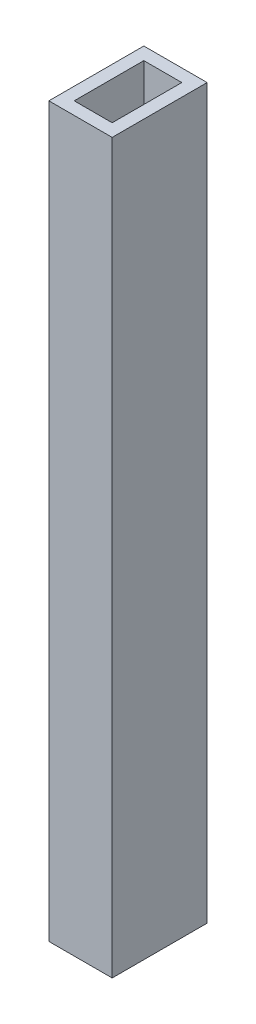
ISO-10303-21;
HEADER;
FILE_DESCRIPTION(('STEP AP214'),'2;1');
FILE_NAME('part.step','',(''),(''),'','','');
FILE_SCHEMA(('AUTOMOTIVE_DESIGN { 1 0 10303 214 1 1 1 1 }'));
ENDSEC;
DATA;
#1=APPLICATION_CONTEXT('core data for automotive mechanical design processes');
#2=APPLICATION_PROTOCOL_DEFINITION('international standard','automotive_design',2000,#1);
#3=PRODUCT_CONTEXT('',#1,'mechanical');
#4=PRODUCT('Part','Part','',(#3));
#5=PRODUCT_RELATED_PRODUCT_CATEGORY('part','',(#4));
#6=PRODUCT_DEFINITION_FORMATION('','',#4);
#7=PRODUCT_DEFINITION_CONTEXT('part definition',#1,'design');
#8=PRODUCT_DEFINITION('design','',#6,#7);
#9=PRODUCT_DEFINITION_SHAPE('','',#8);
#10=(LENGTH_UNIT() NAMED_UNIT(*) SI_UNIT(.MILLI.,.METRE.));
#11=(NAMED_UNIT(*) PLANE_ANGLE_UNIT() SI_UNIT($,.RADIAN.));
#12=(NAMED_UNIT(*) SI_UNIT($,.STERADIAN.) SOLID_ANGLE_UNIT());
#13=UNCERTAINTY_MEASURE_WITH_UNIT(LENGTH_MEASURE(1.E-05),#10,'distance_accuracy_value','');
#14=(GEOMETRIC_REPRESENTATION_CONTEXT(3) GLOBAL_UNCERTAINTY_ASSIGNED_CONTEXT((#13)) GLOBAL_UNIT_ASSIGNED_CONTEXT((#10,
#11,#12)) REPRESENTATION_CONTEXT('',''));
#15=CARTESIAN_POINT('',(0.,0.,0.));
#16=DIRECTION('',(0.,0.,1.));
#17=DIRECTION('',(1.,0.,0.));
#18=AXIS2_PLACEMENT_3D('',#15,#16,#17);
#19=CARTESIAN_POINT('',(5.,115.,-7.5));
#20=DIRECTION('',(-1.,0.,0.));
#21=DIRECTION('',(0.,0.,1.));
#22=AXIS2_PLACEMENT_3D('',#19,#20,#21);
#23=PLANE('',#22);
#24=DIRECTION('',(0.,0.,-1.));
#25=VECTOR('',#24,1.);
#26=CARTESIAN_POINT('',(5.,0.,-7.5));
#27=LINE('',#26,#25);
#28=CARTESIAN_POINT('',(5.,0.,7.5));
#29=VERTEX_POINT('',#28);
#30=CARTESIAN_POINT('',(5.,0.,-7.5));
#31=VERTEX_POINT('',#30);
#32=EDGE_CURVE('E188',#29,#31,#27,.T.);
#33=ORIENTED_EDGE('',*,*,#32,.T.);
#34=DIRECTION('',(0.,-1.,0.));
#35=VECTOR('',#34,1.);
#36=CARTESIAN_POINT('',(5.,115.,-7.5));
#37=LINE('',#36,#35);
#38=CARTESIAN_POINT('',(5.,115.,-7.5));
#39=VERTEX_POINT('',#38);
#40=EDGE_CURVE('E11',#39,#31,#37,.T.);
#41=ORIENTED_EDGE('',*,*,#40,.F.);
#42=DIRECTION('',(0.,0.,-1.));
#43=VECTOR('',#42,1.);
#44=CARTESIAN_POINT('',(5.,115.,-7.5));
#45=LINE('',#44,#43);
#46=CARTESIAN_POINT('',(5.,115.,7.5));
#47=VERTEX_POINT('',#46);
#48=EDGE_CURVE('E194',#47,#39,#45,.T.);
#49=ORIENTED_EDGE('',*,*,#48,.F.);
#50=DIRECTION('',(0.,-1.,0.));
#51=VECTOR('',#50,1.);
#52=CARTESIAN_POINT('',(5.,115.,7.5));
#53=LINE('',#52,#51);
#54=EDGE_CURVE('E204',#47,#29,#53,.T.);
#55=ORIENTED_EDGE('',*,*,#54,.T.);
#56=EDGE_LOOP('',(#33,#41,#49,#55));
#57=FACE_BOUND('',#56,.T.);
#58=ADVANCED_FACE('F39',(#57),#23,.F.);
#59=CARTESIAN_POINT('',(-5.,115.,-7.5));
#60=DIRECTION('',(0.,0.,1.));
#61=DIRECTION('',(1.,0.,0.));
#62=AXIS2_PLACEMENT_3D('',#59,#60,#61);
#63=PLANE('',#62);
#64=DIRECTION('',(-1.,0.,0.));
#65=VECTOR('',#64,1.);
#66=CARTESIAN_POINT('',(-5.,0.,-7.5));
#67=LINE('',#66,#65);
#68=CARTESIAN_POINT('',(-5.,0.,-7.5));
#69=VERTEX_POINT('',#68);
#70=EDGE_CURVE('E207',#31,#69,#67,.T.);
#71=ORIENTED_EDGE('',*,*,#70,.T.);
#72=DIRECTION('',(0.,-1.,0.));
#73=VECTOR('',#72,1.);
#74=CARTESIAN_POINT('',(-5.,115.,-7.5));
#75=LINE('',#74,#73);
#76=CARTESIAN_POINT('',(-5.,115.,-7.5));
#77=VERTEX_POINT('',#76);
#78=EDGE_CURVE('E46',#77,#69,#75,.T.);
#79=ORIENTED_EDGE('',*,*,#78,.F.);
#80=DIRECTION('',(-1.,0.,0.));
#81=VECTOR('',#80,1.);
#82=CARTESIAN_POINT('',(-5.,115.,-7.5));
#83=LINE('',#82,#81);
#84=EDGE_CURVE('E197',#39,#77,#83,.T.);
#85=ORIENTED_EDGE('',*,*,#84,.F.);
#86=ORIENTED_EDGE('',*,*,#40,.T.);
#87=EDGE_LOOP('',(#71,#79,#85,#86));
#88=FACE_BOUND('',#87,.T.);
#89=ADVANCED_FACE('F237',(#88),#63,.F.);
#90=CARTESIAN_POINT('',(-5.,115.,-7.5));
#91=DIRECTION('',(1.,0.,0.));
#92=DIRECTION('',(0.,0.,-1.));
#93=AXIS2_PLACEMENT_3D('',#90,#91,#92);
#94=PLANE('',#93);
#95=DIRECTION('',(0.,0.,1.));
#96=VECTOR('',#95,1.);
#97=CARTESIAN_POINT('',(-5.,0.,-7.5));
#98=LINE('',#97,#96);
#99=CARTESIAN_POINT('',(-5.,0.,7.5));
#100=VERTEX_POINT('',#99);
#101=EDGE_CURVE('E209',#69,#100,#98,.T.);
#102=ORIENTED_EDGE('',*,*,#101,.T.);
#103=DIRECTION('',(0.,-1.,0.));
#104=VECTOR('',#103,1.);
#105=CARTESIAN_POINT('',(-5.,115.,7.5));
#106=LINE('',#105,#104);
#107=CARTESIAN_POINT('',(-5.,115.,7.5));
#108=VERTEX_POINT('',#107);
#109=EDGE_CURVE('E214',#108,#100,#106,.T.);
#110=ORIENTED_EDGE('',*,*,#109,.F.);
#111=DIRECTION('',(0.,0.,1.));
#112=VECTOR('',#111,1.);
#113=CARTESIAN_POINT('',(-5.,115.,-7.5));
#114=LINE('',#113,#112);
#115=EDGE_CURVE('E200',#77,#108,#114,.T.);
#116=ORIENTED_EDGE('',*,*,#115,.F.);
#117=ORIENTED_EDGE('',*,*,#78,.T.);
#118=EDGE_LOOP('',(#102,#110,#116,#117));
#119=FACE_BOUND('',#118,.T.);
#120=ADVANCED_FACE('F221',(#119),#94,.F.);
#121=CARTESIAN_POINT('',(-5.,115.,7.5));
#122=DIRECTION('',(0.,0.,-1.));
#123=DIRECTION('',(-1.,0.,0.));
#124=AXIS2_PLACEMENT_3D('',#121,#122,#123);
#125=PLANE('',#124);
#126=DIRECTION('',(1.,0.,0.));
#127=VECTOR('',#126,1.);
#128=CARTESIAN_POINT('',(-5.,0.,7.5));
#129=LINE('',#128,#127);
#130=EDGE_CURVE('E198',#100,#29,#129,.T.);
#131=ORIENTED_EDGE('',*,*,#130,.T.);
#132=ORIENTED_EDGE('',*,*,#54,.F.);
#133=DIRECTION('',(1.,0.,0.));
#134=VECTOR('',#133,1.);
#135=CARTESIAN_POINT('',(-5.,115.,7.5));
#136=LINE('',#135,#134);
#137=EDGE_CURVE('E202',#108,#47,#136,.T.);
#138=ORIENTED_EDGE('',*,*,#137,.F.);
#139=ORIENTED_EDGE('',*,*,#109,.T.);
#140=EDGE_LOOP('',(#131,#132,#138,#139));
#141=FACE_BOUND('',#140,.T.);
#142=ADVANCED_FACE('F230',(#141),#125,.F.);
#143=CARTESIAN_POINT('',(0.,115.,0.));
#144=DIRECTION('',(0.,1.,0.));
#145=DIRECTION('',(0.,0.,1.));
#146=AXIS2_PLACEMENT_3D('',#143,#144,#145);
#147=PLANE('',#146);
#148=DIRECTION('',(0.,0.,-1.));
#149=VECTOR('',#148,1.);
#150=CARTESIAN_POINT('',(3.,115.,-7.5));
#151=LINE('',#150,#149);
#152=CARTESIAN_POINT('',(3.,115.,5.5));
#153=VERTEX_POINT('',#152);
#154=CARTESIAN_POINT('',(3.,115.,-5.5));
#155=VERTEX_POINT('',#154);
#156=EDGE_CURVE('E156',#153,#155,#151,.T.);
#157=ORIENTED_EDGE('',*,*,#156,.F.);
#158=DIRECTION('',(1.,0.,0.));
#159=VECTOR('',#158,1.);
#160=CARTESIAN_POINT('',(-5.,115.,5.5));
#161=LINE('',#160,#159);
#162=CARTESIAN_POINT('',(-3.,115.,5.5));
#163=VERTEX_POINT('',#162);
#164=EDGE_CURVE('E161',#163,#153,#161,.T.);
#165=ORIENTED_EDGE('',*,*,#164,.F.);
#166=DIRECTION('',(0.,0.,1.));
#167=VECTOR('',#166,1.);
#168=CARTESIAN_POINT('',(-3.,115.,-7.5));
#169=LINE('',#168,#167);
#170=CARTESIAN_POINT('',(-3.,115.,-5.5));
#171=VERTEX_POINT('',#170);
#172=EDGE_CURVE('E159',#171,#163,#169,.T.);
#173=ORIENTED_EDGE('',*,*,#172,.F.);
#174=DIRECTION('',(-1.,0.,0.));
#175=VECTOR('',#174,1.);
#176=CARTESIAN_POINT('',(-5.,115.,-5.5));
#177=LINE('',#176,#175);
#178=EDGE_CURVE('E147',#155,#171,#177,.T.);
#179=ORIENTED_EDGE('',*,*,#178,.F.);
#180=EDGE_LOOP('',(#157,#165,#173,#179));
#181=FACE_BOUND('',#180,.T.);
#182=ORIENTED_EDGE('',*,*,#48,.T.);
#183=ORIENTED_EDGE('',*,*,#84,.T.);
#184=ORIENTED_EDGE('',*,*,#115,.T.);
#185=ORIENTED_EDGE('',*,*,#137,.T.);
#186=EDGE_LOOP('',(#182,#183,#184,#185));
#187=FACE_BOUND('',#186,.T.);
#188=ADVANCED_FACE('F236',(#181,#187),#147,.T.);
#189=CARTESIAN_POINT('',(0.,0.,0.));
#190=DIRECTION('',(0.,1.,0.));
#191=DIRECTION('',(0.,0.,1.));
#192=AXIS2_PLACEMENT_3D('',#189,#190,#191);
#193=PLANE('',#192);
#194=DIRECTION('',(-1.,0.,0.));
#195=VECTOR('',#194,1.);
#196=CARTESIAN_POINT('',(-1.5,0.,2.));
#197=LINE('',#196,#195);
#198=CARTESIAN_POINT('',(1.5,0.,2.));
#199=VERTEX_POINT('',#198);
#200=CARTESIAN_POINT('',(-1.5,0.,2.));
#201=VERTEX_POINT('',#200);
#202=EDGE_CURVE('E178',#199,#201,#197,.T.);
#203=ORIENTED_EDGE('',*,*,#202,.F.);
#204=DIRECTION('',(0.,0.,1.));
#205=VECTOR('',#204,1.);
#206=CARTESIAN_POINT('',(1.5,0.,2.));
#207=LINE('',#206,#205);
#208=CARTESIAN_POINT('',(1.5,0.,-2.));
#209=VERTEX_POINT('',#208);
#210=EDGE_CURVE('E61',#209,#199,#207,.T.);
#211=ORIENTED_EDGE('',*,*,#210,.F.);
#212=DIRECTION('',(1.,0.,0.));
#213=VECTOR('',#212,1.);
#214=CARTESIAN_POINT('',(-1.5,0.,-2.));
#215=LINE('',#214,#213);
#216=CARTESIAN_POINT('',(-1.5,0.,-2.));
#217=VERTEX_POINT('',#216);
#218=EDGE_CURVE('E167',#217,#209,#215,.T.);
#219=ORIENTED_EDGE('',*,*,#218,.F.);
#220=DIRECTION('',(0.,0.,-1.));
#221=VECTOR('',#220,1.);
#222=CARTESIAN_POINT('',(-1.5,0.,2.));
#223=LINE('',#222,#221);
#224=EDGE_CURVE('E181',#201,#217,#223,.T.);
#225=ORIENTED_EDGE('',*,*,#224,.F.);
#226=EDGE_LOOP('',(#203,#211,#219,#225));
#227=FACE_BOUND('',#226,.T.);
#228=ORIENTED_EDGE('',*,*,#32,.F.);
#229=ORIENTED_EDGE('',*,*,#130,.F.);
#230=ORIENTED_EDGE('',*,*,#101,.F.);
#231=ORIENTED_EDGE('',*,*,#70,.F.);
#232=EDGE_LOOP('',(#228,#229,#230,#231));
#233=FACE_BOUND('',#232,.T.);
#234=ADVANCED_FACE('F227',(#227,#233),#193,.F.);
#235=CARTESIAN_POINT('',(1.5,3.,2.));
#236=DIRECTION('',(1.,0.,0.));
#237=DIRECTION('',(0.,0.,-1.));
#238=AXIS2_PLACEMENT_3D('',#235,#236,#237);
#239=PLANE('',#238);
#240=ORIENTED_EDGE('',*,*,#210,.T.);
#241=DIRECTION('',(0.,-1.,0.));
#242=VECTOR('',#241,1.);
#243=CARTESIAN_POINT('',(1.5,3.,2.));
#244=LINE('',#243,#242);
#245=CARTESIAN_POINT('',(1.5,3.,2.));
#246=VERTEX_POINT('',#245);
#247=EDGE_CURVE('E176',#246,#199,#244,.T.);
#248=ORIENTED_EDGE('',*,*,#247,.F.);
#249=DIRECTION('',(0.,0.,1.));
#250=VECTOR('',#249,1.);
#251=CARTESIAN_POINT('',(1.5,3.,2.));
#252=LINE('',#251,#250);
#253=CARTESIAN_POINT('',(1.5,3.,-2.));
#254=VERTEX_POINT('',#253);
#255=EDGE_CURVE('E163',#254,#246,#252,.T.);
#256=ORIENTED_EDGE('',*,*,#255,.F.);
#257=DIRECTION('',(0.,-1.,0.));
#258=VECTOR('',#257,1.);
#259=CARTESIAN_POINT('',(1.5,3.,-2.));
#260=LINE('',#259,#258);
#261=EDGE_CURVE('E186',#254,#209,#260,.T.);
#262=ORIENTED_EDGE('',*,*,#261,.T.);
#263=EDGE_LOOP('',(#240,#248,#256,#262));
#264=FACE_BOUND('',#263,.T.);
#265=ADVANCED_FACE('F249',(#264),#239,.F.);
#266=CARTESIAN_POINT('',(-1.5,3.,-2.));
#267=DIRECTION('',(0.,0.,-1.));
#268=DIRECTION('',(-1.,0.,0.));
#269=AXIS2_PLACEMENT_3D('',#266,#267,#268);
#270=PLANE('',#269);
#271=ORIENTED_EDGE('',*,*,#218,.T.);
#272=ORIENTED_EDGE('',*,*,#261,.F.);
#273=DIRECTION('',(1.,0.,0.));
#274=VECTOR('',#273,1.);
#275=CARTESIAN_POINT('',(-1.5,3.,-2.));
#276=LINE('',#275,#274);
#277=CARTESIAN_POINT('',(-1.5,3.,-2.));
#278=VERTEX_POINT('',#277);
#279=EDGE_CURVE('E173',#278,#254,#276,.T.);
#280=ORIENTED_EDGE('',*,*,#279,.F.);
#281=DIRECTION('',(0.,-1.,0.));
#282=VECTOR('',#281,1.);
#283=CARTESIAN_POINT('',(-1.5,3.,-2.));
#284=LINE('',#283,#282);
#285=EDGE_CURVE('E189',#278,#217,#284,.T.);
#286=ORIENTED_EDGE('',*,*,#285,.T.);
#287=EDGE_LOOP('',(#271,#272,#280,#286));
#288=FACE_BOUND('',#287,.T.);
#289=ADVANCED_FACE('F256',(#288),#270,.F.);
#290=CARTESIAN_POINT('',(-1.5,3.,2.));
#291=DIRECTION('',(-1.,0.,0.));
#292=DIRECTION('',(0.,0.,1.));
#293=AXIS2_PLACEMENT_3D('',#290,#291,#292);
#294=PLANE('',#293);
#295=ORIENTED_EDGE('',*,*,#224,.T.);
#296=ORIENTED_EDGE('',*,*,#285,.F.);
#297=DIRECTION('',(0.,0.,-1.));
#298=VECTOR('',#297,1.);
#299=CARTESIAN_POINT('',(-1.5,3.,2.));
#300=LINE('',#299,#298);
#301=CARTESIAN_POINT('',(-1.5,3.,2.));
#302=VERTEX_POINT('',#301);
#303=EDGE_CURVE('E170',#302,#278,#300,.T.);
#304=ORIENTED_EDGE('',*,*,#303,.F.);
#305=DIRECTION('',(0.,-1.,0.));
#306=VECTOR('',#305,1.);
#307=CARTESIAN_POINT('',(-1.5,3.,2.));
#308=LINE('',#307,#306);
#309=EDGE_CURVE('E191',#302,#201,#308,.T.);
#310=ORIENTED_EDGE('',*,*,#309,.T.);
#311=EDGE_LOOP('',(#295,#296,#304,#310));
#312=FACE_BOUND('',#311,.T.);
#313=ADVANCED_FACE('F261',(#312),#294,.F.);
#314=CARTESIAN_POINT('',(-1.5,3.,2.));
#315=DIRECTION('',(0.,0.,1.));
#316=DIRECTION('',(1.,0.,0.));
#317=AXIS2_PLACEMENT_3D('',#314,#315,#316);
#318=PLANE('',#317);
#319=ORIENTED_EDGE('',*,*,#202,.T.);
#320=ORIENTED_EDGE('',*,*,#309,.F.);
#321=DIRECTION('',(-1.,0.,0.));
#322=VECTOR('',#321,1.);
#323=CARTESIAN_POINT('',(-1.5,3.,2.));
#324=LINE('',#323,#322);
#325=EDGE_CURVE('E166',#246,#302,#324,.T.);
#326=ORIENTED_EDGE('',*,*,#325,.F.);
#327=ORIENTED_EDGE('',*,*,#247,.T.);
#328=EDGE_LOOP('',(#319,#320,#326,#327));
#329=FACE_BOUND('',#328,.T.);
#330=ADVANCED_FACE('F257',(#329),#318,.F.);
#331=CARTESIAN_POINT('',(0.,3.,0.));
#332=DIRECTION('',(0.,-1.,0.));
#333=DIRECTION('',(0.,0.,-1.));
#334=AXIS2_PLACEMENT_3D('',#331,#332,#333);
#335=PLANE('',#334);
#336=ORIENTED_EDGE('',*,*,#255,.T.);
#337=ORIENTED_EDGE('',*,*,#325,.T.);
#338=ORIENTED_EDGE('',*,*,#303,.T.);
#339=ORIENTED_EDGE('',*,*,#279,.T.);
#340=EDGE_LOOP('',(#336,#337,#338,#339));
#341=FACE_BOUND('',#340,.T.);
#342=ADVANCED_FACE('F260',(#341),#335,.T.);
#343=CARTESIAN_POINT('',(0.,90.,0.));
#344=DIRECTION('',(0.,1.,0.));
#345=DIRECTION('',(0.,0.,1.));
#346=AXIS2_PLACEMENT_3D('',#343,#344,#345);
#347=PLANE('',#346);
#348=DIRECTION('',(0.,0.,1.));
#349=VECTOR('',#348,1.);
#350=CARTESIAN_POINT('',(-3.,90.,-7.5));
#351=LINE('',#350,#349);
#352=CARTESIAN_POINT('',(-3.,90.,-5.5));
#353=VERTEX_POINT('',#352);
#354=CARTESIAN_POINT('',(-3.,90.,5.5));
#355=VERTEX_POINT('',#354);
#356=EDGE_CURVE('E127',#353,#355,#351,.T.);
#357=ORIENTED_EDGE('',*,*,#356,.T.);
#358=DIRECTION('',(1.,0.,0.));
#359=VECTOR('',#358,1.);
#360=CARTESIAN_POINT('',(-5.,90.,5.5));
#361=LINE('',#360,#359);
#362=CARTESIAN_POINT('',(3.,90.,5.5));
#363=VERTEX_POINT('',#362);
#364=EDGE_CURVE('E135',#355,#363,#361,.T.);
#365=ORIENTED_EDGE('',*,*,#364,.T.);
#366=DIRECTION('',(0.,0.,-1.));
#367=VECTOR('',#366,1.);
#368=CARTESIAN_POINT('',(3.,90.,-7.5));
#369=LINE('',#368,#367);
#370=CARTESIAN_POINT('',(3.,90.,-5.5));
#371=VERTEX_POINT('',#370);
#372=EDGE_CURVE('E140',#363,#371,#369,.T.);
#373=ORIENTED_EDGE('',*,*,#372,.T.);
#374=DIRECTION('',(-1.,0.,0.));
#375=VECTOR('',#374,1.);
#376=CARTESIAN_POINT('',(-5.,90.,-5.5));
#377=LINE('',#376,#375);
#378=EDGE_CURVE('E136',#371,#353,#377,.T.);
#379=ORIENTED_EDGE('',*,*,#378,.T.);
#380=EDGE_LOOP('',(#357,#365,#373,#379));
#381=FACE_BOUND('',#380,.T.);
#382=ADVANCED_FACE('F139',(#381),#347,.T.);
#383=CARTESIAN_POINT('',(3.,115.,-7.5));
#384=DIRECTION('',(-1.,0.,0.));
#385=DIRECTION('',(0.,0.,1.));
#386=AXIS2_PLACEMENT_3D('',#383,#384,#385);
#387=PLANE('',#386);
#388=ORIENTED_EDGE('',*,*,#372,.F.);
#389=DIRECTION('',(0.,-1.,0.));
#390=VECTOR('',#389,1.);
#391=CARTESIAN_POINT('',(3.,115.,5.5));
#392=LINE('',#391,#390);
#393=EDGE_CURVE('E151',#153,#363,#392,.T.);
#394=ORIENTED_EDGE('',*,*,#393,.F.);
#395=ORIENTED_EDGE('',*,*,#156,.T.);
#396=DIRECTION('',(0.,-1.,0.));
#397=VECTOR('',#396,1.);
#398=CARTESIAN_POINT('',(3.,115.,-5.5));
#399=LINE('',#398,#397);
#400=EDGE_CURVE('E148',#155,#371,#399,.T.);
#401=ORIENTED_EDGE('',*,*,#400,.T.);
#402=EDGE_LOOP('',(#388,#394,#395,#401));
#403=FACE_BOUND('',#402,.T.);
#404=ADVANCED_FACE('F274',(#403),#387,.T.);
#405=CARTESIAN_POINT('',(-5.,115.,-5.5));
#406=DIRECTION('',(0.,0.,1.));
#407=DIRECTION('',(1.,0.,0.));
#408=AXIS2_PLACEMENT_3D('',#405,#406,#407);
#409=PLANE('',#408);
#410=ORIENTED_EDGE('',*,*,#378,.F.);
#411=ORIENTED_EDGE('',*,*,#400,.F.);
#412=ORIENTED_EDGE('',*,*,#178,.T.);
#413=DIRECTION('',(0.,-1.,0.));
#414=VECTOR('',#413,1.);
#415=CARTESIAN_POINT('',(-3.,115.,-5.5));
#416=LINE('',#415,#414);
#417=EDGE_CURVE('E131',#171,#353,#416,.T.);
#418=ORIENTED_EDGE('',*,*,#417,.T.);
#419=EDGE_LOOP('',(#410,#411,#412,#418));
#420=FACE_BOUND('',#419,.T.);
#421=ADVANCED_FACE('F145',(#420),#409,.T.);
#422=CARTESIAN_POINT('',(-3.,115.,-7.5));
#423=DIRECTION('',(1.,0.,0.));
#424=DIRECTION('',(0.,0.,-1.));
#425=AXIS2_PLACEMENT_3D('',#422,#423,#424);
#426=PLANE('',#425);
#427=ORIENTED_EDGE('',*,*,#356,.F.);
#428=ORIENTED_EDGE('',*,*,#417,.F.);
#429=ORIENTED_EDGE('',*,*,#172,.T.);
#430=DIRECTION('',(0.,-1.,0.));
#431=VECTOR('',#430,1.);
#432=CARTESIAN_POINT('',(-3.,115.,5.5));
#433=LINE('',#432,#431);
#434=EDGE_CURVE('E53',#163,#355,#433,.T.);
#435=ORIENTED_EDGE('',*,*,#434,.T.);
#436=EDGE_LOOP('',(#427,#428,#429,#435));
#437=FACE_BOUND('',#436,.T.);
#438=ADVANCED_FACE('F129',(#437),#426,.T.);
#439=CARTESIAN_POINT('',(-5.,115.,5.5));
#440=DIRECTION('',(0.,0.,-1.));
#441=DIRECTION('',(-1.,0.,0.));
#442=AXIS2_PLACEMENT_3D('',#439,#440,#441);
#443=PLANE('',#442);
#444=ORIENTED_EDGE('',*,*,#364,.F.);
#445=ORIENTED_EDGE('',*,*,#434,.F.);
#446=ORIENTED_EDGE('',*,*,#164,.T.);
#447=ORIENTED_EDGE('',*,*,#393,.T.);
#448=EDGE_LOOP('',(#444,#445,#446,#447));
#449=FACE_BOUND('',#448,.T.);
#450=ADVANCED_FACE('F275',(#449),#443,.T.);
#451=CLOSED_SHELL('',(#58,#89,#120,#142,#188,#234,#265,#289,#313,#330,#342,#382,#404,#421,#438,#450));
#452=MANIFOLD_SOLID_BREP('B2',#451);
#453=ADVANCED_BREP_SHAPE_REPRESENTATION('',(#18,#452),#14);
#454=SHAPE_DEFINITION_REPRESENTATION(#9,#453);
ENDSEC;
END-ISO-10303-21;
